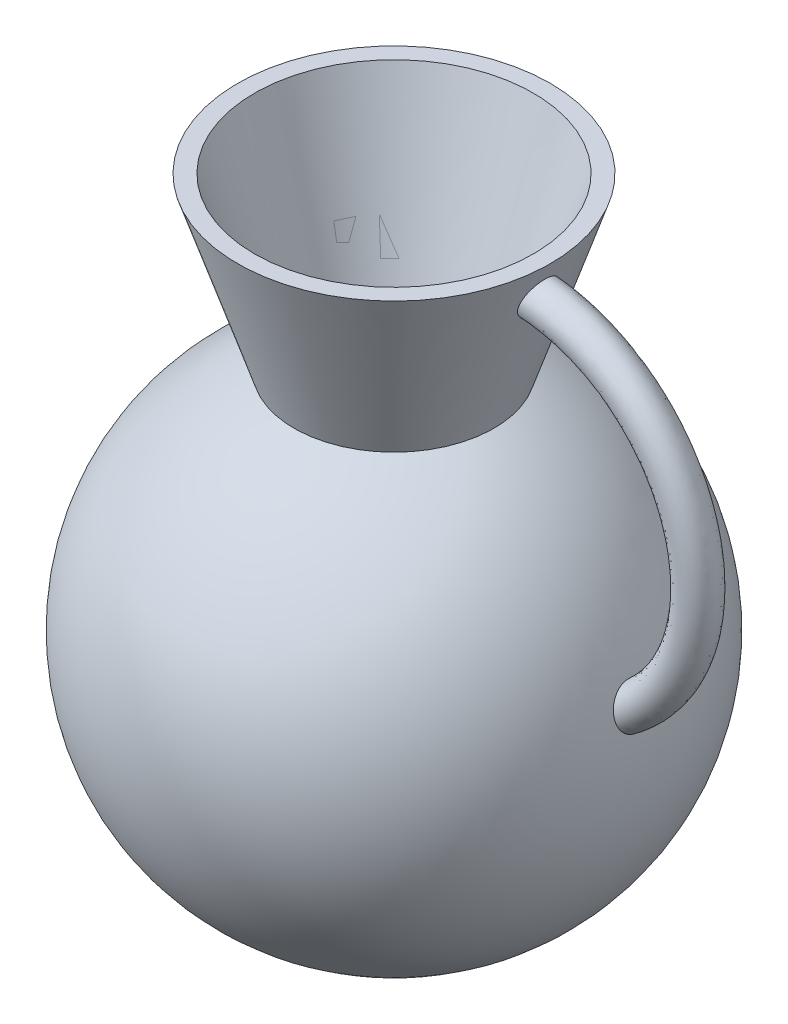
ISO-10303-21;
HEADER;
FILE_DESCRIPTION(('STEP AP214'),'2;1');
FILE_NAME('part.step','',(''),(''),'','','');
FILE_SCHEMA(('AUTOMOTIVE_DESIGN { 1 0 10303 214 1 1 1 1 }'));
ENDSEC;
DATA;
#1=APPLICATION_CONTEXT('core data for automotive mechanical design processes');
#2=APPLICATION_PROTOCOL_DEFINITION('international standard','automotive_design',2000,#1);
#3=PRODUCT_CONTEXT('',#1,'mechanical');
#4=PRODUCT('Part','Part','',(#3));
#5=PRODUCT_RELATED_PRODUCT_CATEGORY('part','',(#4));
#6=PRODUCT_DEFINITION_FORMATION('','',#4);
#7=PRODUCT_DEFINITION_CONTEXT('part definition',#1,'design');
#8=PRODUCT_DEFINITION('design','',#6,#7);
#9=PRODUCT_DEFINITION_SHAPE('','',#8);
#10=(LENGTH_UNIT() NAMED_UNIT(*) SI_UNIT(.MILLI.,.METRE.));
#11=(NAMED_UNIT(*) PLANE_ANGLE_UNIT() SI_UNIT($,.RADIAN.));
#12=(NAMED_UNIT(*) SI_UNIT($,.STERADIAN.) SOLID_ANGLE_UNIT());
#13=UNCERTAINTY_MEASURE_WITH_UNIT(LENGTH_MEASURE(1.E-05),#10,'distance_accuracy_value','');
#14=(GEOMETRIC_REPRESENTATION_CONTEXT(3) GLOBAL_UNCERTAINTY_ASSIGNED_CONTEXT((#13)) GLOBAL_UNIT_ASSIGNED_CONTEXT((#10,
#11,#12)) REPRESENTATION_CONTEXT('',''));
#15=CARTESIAN_POINT('',(0.,0.,0.));
#16=DIRECTION('',(0.,0.,1.));
#17=DIRECTION('',(1.,0.,0.));
#18=AXIS2_PLACEMENT_3D('',#15,#16,#17);
#19=CARTESIAN_POINT('',(0.,74.0588762852864,0.));
#20=DIRECTION('',(0.,1.,0.));
#21=DIRECTION('',(0.,0.,1.));
#22=AXIS2_PLACEMENT_3D('',#19,#20,#21);
#23=CONICAL_SURFACE('',#22,13.1866009471648,0.318744232350078);
#24=CARTESIAN_POINT('',(0.,99.8387449515132,0.));
#25=DIRECTION('',(0.,1.,0.));
#26=DIRECTION('',(0.,0.,1.));
#27=AXIS2_PLACEMENT_3D('',#24,#25,#26);
#28=CIRCLE('',#27,21.6938624665845);
#29=CARTESIAN_POINT('',(0.,99.8387449515132,21.6938624665845));
#30=VERTEX_POINT('',#29);
#31=EDGE_CURVE('E11',#30,#30,#28,.F.);
#32=ORIENTED_EDGE('',*,*,#31,.F.);
#33=EDGE_LOOP('',(#32));
#34=FACE_BOUND('',#33,.T.);
#35=CARTESIAN_POINT('',(0.,71.8426822581929,0.));
#36=DIRECTION('',(0.,-1.,0.));
#37=DIRECTION('',(0.,0.,-1.));
#38=AXIS2_PLACEMENT_3D('',#35,#36,#37);
#39=CIRCLE('',#38,12.4552650970733);
#40=CARTESIAN_POINT('',(0.,71.8426822581929,-12.4552650970733));
#41=VERTEX_POINT('',#40);
#42=EDGE_CURVE('E54',#41,#41,#39,.T.);
#43=ORIENTED_EDGE('',*,*,#42,.T.);
#44=EDGE_LOOP('',(#43));
#45=FACE_BOUND('',#44,.T.);
#46=ADVANCED_FACE('F49',(#34,#45),#23,.F.);
#47=CARTESIAN_POINT('',(0.,38.2899424262077,0.));
#48=DIRECTION('',(0.,-1.,0.));
#49=DIRECTION('',(-1.,0.,0.));
#50=AXIS2_PLACEMENT_3D('',#47,#48,#49);
#51=SPHERICAL_SURFACE('',#50,35.7899424262077);
#52=ORIENTED_EDGE('',*,*,#42,.F.);
#53=EDGE_LOOP('',(#52));
#54=FACE_BOUND('',#53,.T.);
#55=ADVANCED_FACE('F62',(#54),#51,.F.);
#56=OPEN_SHELL('',(#46,#55));
#57=SHELL_BASED_SURFACE_MODEL('B2',(#56));
#58=CARTESIAN_POINT('',(0.,38.2899424262077,0.));
#59=DIRECTION('',(0.,-1.,0.));
#60=DIRECTION('',(-1.,0.,0.));
#61=AXIS2_PLACEMENT_3D('',#58,#59,#60);
#62=SPHERICAL_SURFACE('',#61,38.2899424262077);
#63=CARTESIAN_POINT('',(37.9355283935638,43.4875742430462,0.));
#64=CARTESIAN_POINT('',(37.9355261015643,43.4875858481802,-0.157933360444489));
#65=CARTESIAN_POINT('',(37.9327060160052,43.5009479959671,-0.316014553461099));
#66=CARTESIAN_POINT('',(37.9215204873269,43.5538867387111,-0.627654197078701));
#67=CARTESIAN_POINT('',(37.9131471771171,43.5935005235309,-0.781205908094663));
#68=CARTESIAN_POINT('',(37.8911836287647,43.697209165149,-1.07901627772444));
#69=CARTESIAN_POINT('',(37.8776047349446,43.7612507858194,-1.22329435318908));
#70=CARTESIAN_POINT('',(37.8456959039435,43.9113503306973,-1.49923209160159));
#71=CARTESIAN_POINT('',(37.8273667074557,43.9974048225097,-1.63089371739566));
#72=CARTESIAN_POINT('',(37.7858482482907,44.1917055912168,-1.88285019807154));
#73=CARTESIAN_POINT('',(37.7625194119025,44.3005866477069,-2.00263121662743));
#74=CARTESIAN_POINT('',(37.7120674907361,44.5351398325327,-2.2234593990031));
#75=CARTESIAN_POINT('',(37.6849432268402,44.660817178391,-2.32450071822649));
#76=CARTESIAN_POINT('',(37.6253262593124,44.9358331328088,-2.51347961166638));
#77=CARTESIAN_POINT('',(37.5925789809347,45.0862557507716,-2.5997580445385));
#78=CARTESIAN_POINT('',(37.5243144100588,45.3981889110757,-2.74760652351043));
#79=CARTESIAN_POINT('',(37.4887960662283,45.5597036589213,-2.80916713677716));
#80=CARTESIAN_POINT('',(37.4126382801933,45.9040865634904,-2.91127745900275));
#81=CARTESIAN_POINT('',(37.3718217015611,46.0875927724751,-2.94954659987977));
#82=CARTESIAN_POINT('',(37.2888854229696,46.4580884127531,-2.99611763171413));
#83=CARTESIAN_POINT('',(37.2467652558493,46.645079082977,-3.00440865114434));
#84=CARTESIAN_POINT('',(37.1595026560535,47.0299493905033,-2.99077881112345));
#85=CARTESIAN_POINT('',(37.1143398714071,47.2277569881588,-2.96688321595232));
#86=CARTESIAN_POINT('',(37.0248298465806,47.6170824452631,-2.88578385610287));
#87=CARTESIAN_POINT('',(36.9804844854217,47.8085864563298,-2.82851133449396));
#88=CARTESIAN_POINT('',(36.8935495663234,48.1814941702133,-2.68058690845582));
#89=CARTESIAN_POINT('',(36.8509873472805,48.3627496998056,-2.58954402148319));
#90=CARTESIAN_POINT('',(36.7698574174585,48.7060769416384,-2.37565944867056));
#91=CARTESIAN_POINT('',(36.7312795231774,48.8681977198808,-2.25290178668668));
#92=CARTESIAN_POINT('',(36.6788145257868,49.0874835627675,-2.05104449043293));
#93=CARTESIAN_POINT('',(36.6626712882251,49.1547624535222,-1.9832537826099));
#94=CARTESIAN_POINT('',(36.6318506276583,49.2829014801984,-1.8415749448434));
#95=CARTESIAN_POINT('',(36.6171723393295,49.3437654065491,-1.76769046207868));
#96=CARTESIAN_POINT('',(36.5894908270204,49.4582999253126,-1.6143099508065));
#97=CARTESIAN_POINT('',(36.5764867325065,49.511974256704,-1.53481687217112));
#98=CARTESIAN_POINT('',(36.5523464901676,49.6114282792391,-1.37075122319947));
#99=CARTESIAN_POINT('',(36.5412103321446,49.6572080134834,-1.28617868059801));
#100=CARTESIAN_POINT('',(36.5221605138188,49.7354011136289,-1.12262555560045));
#101=CARTESIAN_POINT('',(36.5140238090945,49.7687450290272,-1.04411482134737));
#102=CARTESIAN_POINT('',(36.4994893687334,49.8282427172622,-0.884260613632248));
#103=CARTESIAN_POINT('',(36.4930914224826,49.8543973609326,-0.802917484603175));
#104=CARTESIAN_POINT('',(36.482139817086,49.8991329269225,-0.638105338003654));
#105=CARTESIAN_POINT('',(36.4775850135365,49.9177185488794,-0.554637673881843));
#106=CARTESIAN_POINT('',(36.4703912121744,49.9470594261377,-0.386255972542294));
#107=CARTESIAN_POINT('',(36.4677520742153,49.9578152542525,-0.301342041596014));
#108=CARTESIAN_POINT('',(36.4646022565865,49.9706508000874,-0.13943627550076));
#109=CARTESIAN_POINT('',(36.4639040024066,49.9734951364768,-0.0625077594182249));
#110=CARTESIAN_POINT('',(36.4641030096527,49.9726843720806,0.0913400874299616));
#111=CARTESIAN_POINT('',(36.4650008096922,49.9690270772174,0.168259406331111));
#112=CARTESIAN_POINT('',(36.4683800629035,49.9552556248877,0.321442076668946));
#113=CARTESIAN_POINT('',(36.4708606214461,49.9451451149973,0.397705774021289));
#114=CARTESIAN_POINT('',(36.4773676018359,49.9186050486236,0.549067309752856));
#115=CARTESIAN_POINT('',(36.4813946075945,49.9021731052731,0.624164696596318));
#116=CARTESIAN_POINT('',(36.4954768801076,49.8446593010842,0.843077809668257));
#117=CARTESIAN_POINT('',(36.5076289293054,49.7949724111284,0.984597630772383));
#118=CARTESIAN_POINT('',(36.5370266401155,49.6744214712045,1.25759619261692));
#119=CARTESIAN_POINT('',(36.554273191114,49.6035537235064,1.3890731750538));
#120=CARTESIAN_POINT('',(36.5942318235826,49.4387601434914,1.64643760586559));
#121=CARTESIAN_POINT('',(36.6171942307241,49.3437723969308,1.77160921394827));
#122=CARTESIAN_POINT('',(36.6545929137729,49.1883720303957,1.94705644189836));
#123=CARTESIAN_POINT('',(36.6675576865972,49.134393536448,2.00350815670589));
#124=CARTESIAN_POINT('',(36.6943752247707,49.0224857653457,2.11217818353919));
#125=CARTESIAN_POINT('',(36.7082284036972,48.9645546473225,2.16439449787494));
#126=CARTESIAN_POINT('',(36.7538487139186,48.773320057282,2.32453267995243));
#127=CARTESIAN_POINT('',(36.787132161966,48.6331228004795,2.42396517581188));
#128=CARTESIAN_POINT('',(36.8564265187655,48.3395230949388,2.60000997074014));
#129=CARTESIAN_POINT('',(36.8924420863432,48.1860980263654,2.67658213908745));
#130=CARTESIAN_POINT('',(36.9700645916392,47.8534144295457,2.81268816717162));
#131=CARTESIAN_POINT('',(37.0118631619376,47.6731297097561,2.86961620574553));
#132=CARTESIAN_POINT('',(37.0964219667721,47.3059341483061,2.95370340743422));
#133=CARTESIAN_POINT('',(37.1391826128527,47.1190204504982,2.98084957390686));
#134=CARTESIAN_POINT('',(37.2273525155134,46.7310468946064,3.00564938190486));
#135=CARTESIAN_POINT('',(37.2727541559797,46.5298541524273,3.00128143474899));
#136=CARTESIAN_POINT('',(37.3621330082567,46.1310955718989,2.9578909153403));
#137=CARTESIAN_POINT('',(37.406112320816,45.9335245906249,2.91892212123363));
#138=CARTESIAN_POINT('',(37.4700315301096,45.6445881145665,2.83481246764317));
#139=CARTESIAN_POINT('',(37.4909878651802,45.549551300188,2.80251893864909));
#140=CARTESIAN_POINT('',(37.5320801853596,45.3626419984517,2.72947518010567));
#141=CARTESIAN_POINT('',(37.5522167137417,45.2707674219813,2.68873066372498));
#142=CARTESIAN_POINT('',(37.5915139456409,45.0909648275053,2.59891426793612));
#143=CARTESIAN_POINT('',(37.6106746389108,45.003036850944,2.5498423011052));
#144=CARTESIAN_POINT('',(37.6478576209123,44.8319561905149,2.44357266320763));
#145=CARTESIAN_POINT('',(37.6658798102242,44.7488039237435,2.38637428391513));
#146=CARTESIAN_POINT('',(37.6994828977141,44.5933877790274,2.26813276310447));
#147=CARTESIAN_POINT('',(37.7151463378252,44.5207674727533,2.20758139661846));
#148=CARTESIAN_POINT('',(37.7451869731879,44.3812020958806,2.07996905204923));
#149=CARTESIAN_POINT('',(37.7595642870891,44.3142565018,2.0129086756374));
#150=CARTESIAN_POINT('',(37.7868931492015,44.1867683294095,1.87269995648037));
#151=CARTESIAN_POINT('',(37.7998449090792,44.1262248005722,1.79955252038312));
#152=CARTESIAN_POINT('',(37.8241896009954,44.0122400480373,1.64767780295122));
#153=CARTESIAN_POINT('',(37.8355827068691,43.958798032334,1.56895114535083));
#154=CARTESIAN_POINT('',(37.8557084361854,43.8642637940732,1.41404373586874));
#155=CARTESIAN_POINT('',(37.8645895997951,43.8224868006365,1.33829952847417));
#156=CARTESIAN_POINT('',(37.8808765543648,43.7457929654615,1.18326711213178));
#157=CARTESIAN_POINT('',(37.8882825273557,43.7108752773273,1.10397934192161));
#158=CARTESIAN_POINT('',(37.9015314466285,43.648357871123,0.942606140417039));
#159=CARTESIAN_POINT('',(37.9073771994442,43.6207450138781,0.860526036093724));
#160=CARTESIAN_POINT('',(37.9174584691716,43.5730970561849,0.69413534879281));
#161=CARTESIAN_POINT('',(37.9216946646048,43.553058762639,0.609825721755727));
#162=CARTESIAN_POINT('',(37.9285648311529,43.5205494772271,0.438348655312332));
#163=CARTESIAN_POINT('',(37.9311733299132,43.5081987984121,0.351157232797603));
#164=CARTESIAN_POINT('',(37.9346557301054,43.4917080406926,0.17599250078528));
#165=CARTESIAN_POINT('',(37.9355296709379,43.4875677752884,0.088019209093465));
#166=CARTESIAN_POINT('',(37.9355283935638,43.4875742430462,0.));
#167=B_SPLINE_CURVE_WITH_KNOTS('',3,(#63,#64,#65,#66,#67,#68,#69,#70,#71,#72,#73,#74,#75,#76,
#77,#78,#79,#80,#81,#82,#83,#84,#85,#86,#87,#88,#89,#90,#91,#92,#93,#94,#95,#96,#97,#98,#99,
#100,#101,#102,#103,#104,#105,#106,#107,#108,#109,#110,#111,#112,#113,#114,#115,#116,#117,#118,
#119,#120,#121,#122,#123,#124,#125,#126,#127,#128,#129,#130,#131,#132,#133,#134,#135,#136,#137,
#138,#139,#140,#141,#142,#143,#144,#145,#146,#147,#148,#149,#150,#151,#152,#153,#154,#155,#156,
#157,#158,#159,#160,#161,#162,#163,#164,#165,#166),.UNSPECIFIED.,.T.,.F.,(4,2,2,2,2,2,2,2,2,2,2,
2,2,2,2,2,2,2,2,2,2,2,2,2,2,2,2,2,2,2,2,2,2,2,2,2,2,2,2,2,2,2,2,2,2,2,2,2,2,2,2,4),(0.,
0.473476622589933,0.947625442548178,1.42074678926413,1.89379440863449,2.38234283778606,
2.87104338166737,3.39823932159573,3.92563625965607,4.49869488649049,5.07196131146559,
5.68204904577176,6.29339803420117,6.91205794440499,7.52909531629285,7.81935240890508,
8.10943702345101,8.39937018767534,8.68930176895459,8.94600756838211,9.2026822594151,
9.45919733617704,9.71569364487989,9.94636062872394,10.17710546954,10.407720000906,
10.6384216940487,11.0876736823058,11.5370041463194,12.0112866776871,12.2486262834131,
12.4860771907245,13.0089614563421,13.5327583063045,14.1111194897389,14.689732966482,
15.305778983896,15.9208691884816,16.228154138686,16.5352320264698,16.8423131382003,
17.149421028825,17.4365613985819,17.7236752512625,18.0107464155409,18.297785536906,
18.5583109292752,18.8188041542043,19.0788255950736,19.3387372999559,19.6026206518289,
19.8664980095152),.UNSPECIFIED.);
#168=CARTESIAN_POINT('',(37.9355283935638,43.4875742430462,0.));
#169=VERTEX_POINT('',#168);
#170=EDGE_CURVE('E48',#169,#169,#167,.T.);
#171=ORIENTED_EDGE('',*,*,#170,.F.);
#172=EDGE_LOOP('',(#171));
#173=FACE_BOUND('',#172,.T.);
#174=CARTESIAN_POINT('',(0.,73.2754405508589,0.));
#175=DIRECTION('',(0.,-1.,0.));
#176=DIRECTION('',(0.,0.,-1.));
#177=AXIS2_PLACEMENT_3D('',#174,#175,#176);
#178=CIRCLE('',#177,15.5606751772642);
#179=CARTESIAN_POINT('',(0.,73.2754405508589,-15.5606751772642));
#180=VERTEX_POINT('',#179);
#181=EDGE_CURVE('E146',#180,#180,#178,.T.);
#182=ORIENTED_EDGE('',*,*,#181,.T.);
#183=EDGE_LOOP('',(#182));
#184=FACE_BOUND('',#183,.T.);
#185=ADVANCED_FACE('F81',(#173,#184),#62,.T.);
#186=CARTESIAN_POINT('',(0.,99.8387449515132,0.));
#187=DIRECTION('',(0.,1.,0.));
#188=DIRECTION('',(0.,0.,1.));
#189=AXIS2_PLACEMENT_3D('',#186,#187,#188);
#190=PLANE('',#189);
#191=CARTESIAN_POINT('',(0.,99.8387449515132,0.));
#192=DIRECTION('',(0.,1.,0.));
#193=DIRECTION('',(0.,0.,1.));
#194=AXIS2_PLACEMENT_3D('',#191,#192,#193);
#195=CIRCLE('',#194,21.6938624665845);
#196=CARTESIAN_POINT('',(0.,99.8387449515132,21.6938624665845));
#197=VERTEX_POINT('',#196);
#198=EDGE_CURVE('E141',#197,#197,#195,.F.);
#199=ORIENTED_EDGE('',*,*,#198,.T.);
#200=EDGE_LOOP('',(#199));
#201=FACE_BOUND('',#200,.T.);
#202=CARTESIAN_POINT('',(0.,99.8387449515132,0.));
#203=DIRECTION('',(0.,-1.,0.));
#204=DIRECTION('',(0.,0.,-1.));
#205=AXIS2_PLACEMENT_3D('',#202,#203,#204);
#206=CIRCLE('',#205,24.3264675977806);
#207=CARTESIAN_POINT('',(0.,99.8387449515132,-24.3264675977806));
#208=VERTEX_POINT('',#207);
#209=EDGE_CURVE('E85',#208,#208,#206,.T.);
#210=ORIENTED_EDGE('',*,*,#209,.F.);
#211=EDGE_LOOP('',(#210));
#212=FACE_BOUND('',#211,.T.);
#213=ADVANCED_FACE('F130',(#201,#212),#190,.T.);
#214=CARTESIAN_POINT('',(0.,73.2754405508589,0.));
#215=DIRECTION('',(0.,1.,0.));
#216=DIRECTION('',(0.,0.,1.));
#217=AXIS2_PLACEMENT_3D('',#214,#215,#216);
#218=CONICAL_SURFACE('',#217,15.5606751772642,0.318744232350078);
#219=CARTESIAN_POINT('',(23.5085881268252,97.3602945949677,0.));
#220=CARTESIAN_POINT('',(23.5085824551509,97.3602852802534,0.162650323265428));
#221=CARTESIAN_POINT('',(23.5026965782478,97.3476099112552,0.325415565230302));
#222=CARTESIAN_POINT('',(23.4794632949356,97.2973164092361,0.646307866500626));
#223=CARTESIAN_POINT('',(23.4621035567716,97.2596714394983,0.804429744077382));
#224=CARTESIAN_POINT('',(23.4169138326947,97.1608110085687,1.11123989616741));
#225=CARTESIAN_POINT('',(23.3891009725873,97.0996340969586,1.25994313850405));
#226=CARTESIAN_POINT('',(23.3244431228525,96.955681707039,1.54429765309924));
#227=CARTESIAN_POINT('',(23.2875989454208,96.8729081708935,1.67995009750301));
#228=CARTESIAN_POINT('',(23.2056254815509,96.6858983802673,1.93815371185203));
#229=CARTESIAN_POINT('',(23.1603148323284,96.5811846486523,2.06030097023538));
#230=CARTESIAN_POINT('',(23.0640837690265,96.3545069873628,2.28476891020845));
#231=CARTESIAN_POINT('',(23.0131620372675,96.232539003866,2.38708491909233));
#232=CARTESIAN_POINT('',(22.9054150413952,95.9686259442003,2.57377825559258));
#233=CARTESIAN_POINT('',(22.8484272214366,95.8260287927068,2.65714087712932));
#234=CARTESIAN_POINT('',(22.7329023064897,95.5290800908951,2.79781115272075));
#235=CARTESIAN_POINT('',(22.6743649303581,95.374726397862,2.85511404387034));
#236=CARTESIAN_POINT('',(22.5563750634322,95.0540522895789,2.94331276992341));
#237=CARTESIAN_POINT('',(22.4969386571096,94.8875245213072,2.97347907335281));
#238=CARTESIAN_POINT('',(22.3808123774316,94.5508053436232,3.00373440395071));
#239=CARTESIAN_POINT('',(22.3241224503346,94.3806140059917,3.00382401988036));
#240=CARTESIAN_POINT('',(22.215640882219,94.0426258826643,2.97362312806095));
#241=CARTESIAN_POINT('',(22.1638186888951,93.8748206864519,2.94353821001387));
#242=CARTESIAN_POINT('',(22.0660127434979,93.545568113561,2.85369423873144));
#243=CARTESIAN_POINT('',(22.0200280427172,93.384119706729,2.79394001511464));
#244=CARTESIAN_POINT('',(21.9359512144007,93.0769975013242,2.64812196233215));
#245=CARTESIAN_POINT('',(21.8976801197307,92.9310162805723,2.56280872931801));
#246=CARTESIAN_POINT('',(21.8279327821002,92.654711176576,2.36759450194919));
#247=CARTESIAN_POINT('',(21.7964556510096,92.5243852478077,2.25769672519887));
#248=CARTESIAN_POINT('',(21.7409492886416,92.2863635734507,2.01914448229274));
#249=CARTESIAN_POINT('',(21.7167690510723,92.1782263950368,1.89096518004984));
#250=CARTESIAN_POINT('',(21.674687499823,91.9843893574613,1.61772396602846));
#251=CARTESIAN_POINT('',(21.6567859361228,91.8986886049034,1.47266272680438));
#252=CARTESIAN_POINT('',(21.6270097957047,91.7529085783211,1.17092006656861));
#253=CARTESIAN_POINT('',(21.6150931088118,91.69265077777,1.0143289853393));
#254=CARTESIAN_POINT('',(21.5967527859306,91.5986833500251,0.693067504616956));
#255=CARTESIAN_POINT('',(21.5903292068789,91.5649739980083,0.528397021399028));
#256=CARTESIAN_POINT('',(21.582744014228,91.5250699028181,0.195352518050924));
#257=CARTESIAN_POINT('',(21.5815913759255,91.5189220914653,0.026972671029098));
#258=CARTESIAN_POINT('',(21.5845285960998,91.5344501553796,-0.308454641260664));
#259=CARTESIAN_POINT('',(21.5886185014189,91.5561262792547,-0.475502094610185));
#260=CARTESIAN_POINT('',(21.6022011280368,91.6267103383462,-0.80375588536174));
#261=CARTESIAN_POINT('',(21.6117012288998,91.6756554667927,-0.964953923979137));
#262=CARTESIAN_POINT('',(21.6364139573082,91.7993329968313,-1.27666401293774));
#263=CARTESIAN_POINT('',(21.651626446982,91.8740647760455,-1.42717632108043));
#264=CARTESIAN_POINT('',(21.6880940522234,92.0468618000877,-1.71293406186256));
#265=CARTESIAN_POINT('',(21.7093373054406,92.1448811776962,-1.8482087440297));
#266=CARTESIAN_POINT('',(21.7581783508073,92.3612959150351,-2.10000287166037));
#267=CARTESIAN_POINT('',(21.7857759412319,92.4796906278997,-2.2165229123096));
#268=CARTESIAN_POINT('',(21.8474071708183,92.7330758778324,-2.42753219019853));
#269=CARTESIAN_POINT('',(21.8814357442116,92.8680533233788,-2.52203863789338));
#270=CARTESIAN_POINT('',(21.955744452138,93.1505377981187,-2.68671644399158));
#271=CARTESIAN_POINT('',(21.9960247886522,93.2980452320594,-2.75688701591822));
#272=CARTESIAN_POINT('',(22.0826952586513,93.60269762053,-2.87186241879566));
#273=CARTESIAN_POINT('',(22.129141415596,93.7599228764014,-2.9164118460168));
#274=CARTESIAN_POINT('',(22.2268674264531,94.0781816585868,-2.9782772455778));
#275=CARTESIAN_POINT('',(22.2781479005466,94.2392156715252,-2.99558971871145));
#276=CARTESIAN_POINT('',(22.3854883817943,94.5645950952762,-3.00301711257143));
#277=CARTESIAN_POINT('',(22.4416337490892,94.7289268622783,-2.99246703175218));
#278=CARTESIAN_POINT('',(22.5558996552616,95.052734764117,-2.94330426898657));
#279=CARTESIAN_POINT('',(22.6140205209486,95.2122100871901,-2.90468692208058));
#280=CARTESIAN_POINT('',(22.7018502057668,95.4465146815846,-2.82598549379568));
#281=CARTESIAN_POINT('',(22.7316205694282,95.5247674018712,-2.79576159289114));
#282=CARTESIAN_POINT('',(22.7908538712161,95.6783844957828,-2.72845284251927));
#283=CARTESIAN_POINT('',(22.8203168837392,95.7537495807703,-2.69136969610093));
#284=CARTESIAN_POINT('',(22.8786260934815,95.9010566734131,-2.61058533267247));
#285=CARTESIAN_POINT('',(22.9074725107011,95.9729999135947,-2.56688652267168));
#286=CARTESIAN_POINT('',(22.9642767799486,96.1130658331841,-2.4730974011167));
#287=CARTESIAN_POINT('',(22.9922336135383,96.1811841973799,-2.42300007137713));
#288=CARTESIAN_POINT('',(23.0744211012814,96.3793646425625,-2.26327954513921));
#289=CARTESIAN_POINT('',(23.1268340884229,96.5029146026155,-2.14441281037114));
#290=CARTESIAN_POINT('',(23.22412160951,96.7286038823779,-1.88521418528559));
#291=CARTESIAN_POINT('',(23.2689988710162,96.8307509522089,-1.74489009676044));
#292=CARTESIAN_POINT('',(23.3282374012418,96.964025387073,-1.52357541462588));
#293=CARTESIAN_POINT('',(23.3464248121069,97.0046641895282,-1.44917506465484));
#294=CARTESIAN_POINT('',(23.380200664545,97.079754641949,-1.29680583558861));
#295=CARTESIAN_POINT('',(23.3957913329496,97.1142115951249,-1.21884008789738));
#296=CARTESIAN_POINT('',(23.424144821609,97.1766232949721,-1.05994303160015));
#297=CARTESIAN_POINT('',(23.436910371989,97.204584320462,-0.979014674931403));
#298=CARTESIAN_POINT('',(23.4594424576879,97.2537877067213,-0.814747776388891));
#299=CARTESIAN_POINT('',(23.469209282958,97.2750307170716,-0.731409468390067));
#300=CARTESIAN_POINT('',(23.4877071318482,97.3151838585512,-0.541196563922332));
#301=CARTESIAN_POINT('',(23.4955206734585,97.3320778108932,-0.433797340623718));
#302=CARTESIAN_POINT('',(23.5059629703368,97.354636082894,-0.217615860737318));
#303=CARTESIAN_POINT('',(23.5085919218933,97.3603008276907,-0.108833656666153));
#304=CARTESIAN_POINT('',(23.5085881268252,97.3602945949677,0.));
#305=B_SPLINE_CURVE_WITH_KNOTS('',3,(#219,#220,#221,#222,#223,#224,#225,#226,#227,#228,#229,
#230,#231,#232,#233,#234,#235,#236,#237,#238,#239,#240,#241,#242,#243,#244,#245,#246,#247,#248,
#249,#250,#251,#252,#253,#254,#255,#256,#257,#258,#259,#260,#261,#262,#263,#264,#265,#266,#267,
#268,#269,#270,#271,#272,#273,#274,#275,#276,#277,#278,#279,#280,#281,#282,#283,#284,#285,#286,
#287,#288,#289,#290,#291,#292,#293,#294,#295,#296,#297,#298,#299,#300,#301,#302,#303,#304),
.UNSPECIFIED.,.T.,.F.,(4,2,2,2,2,2,2,2,2,2,2,2,2,2,2,2,2,2,2,2,2,2,2,2,2,2,2,2,2,2,2,2,2,2,2,2,
2,2,2,2,2,2,4),(0.,0.487559485319246,0.975643838607785,1.46293200336529,1.95017636185471,
2.44939531922667,2.94873176163645,3.47054341131389,3.9924503935781,4.52800172803506,
5.06354257889623,5.5954592219352,6.12728930707762,6.64481984586176,7.16228269027231,
7.66815716932803,8.17401150189744,8.67625490202684,9.1785035078835,9.68160701916005,
10.1847150257198,10.6885109262679,11.192294668218,11.69509426637,12.1978779048379,
12.7002671325313,13.202672594718,13.7100031388245,14.2173988557568,14.7370134925407,
15.256714512365,15.5234934959459,15.7902063309545,16.0568223587051,16.3237333755412,
16.8587628355346,17.3935982218886,17.6534363110658,17.9130504163578,18.1724125306141,
18.4317495588576,18.7580009283017,19.0842399456258),.UNSPECIFIED.);
#306=CARTESIAN_POINT('',(23.5085881268252,97.3602945949677,0.));
#307=VERTEX_POINT('',#306);
#308=EDGE_CURVE('E90',#307,#307,#305,.T.);
#309=ORIENTED_EDGE('',*,*,#308,.F.);
#310=EDGE_LOOP('',(#309));
#311=FACE_BOUND('',#310,.T.);
#312=ORIENTED_EDGE('',*,*,#209,.T.);
#313=EDGE_LOOP('',(#312));
#314=FACE_BOUND('',#313,.T.);
#315=ORIENTED_EDGE('',*,*,#181,.F.);
#316=EDGE_LOOP('',(#315));
#317=FACE_BOUND('',#316,.T.);
#318=ADVANCED_FACE('F124',(#311,#314,#317),#218,.T.);
#319=CARTESIAN_POINT('',(0.,38.2899424262077,0.));
#320=DIRECTION('',(0.,-1.,0.));
#321=DIRECTION('',(-1.,0.,0.));
#322=AXIS2_PLACEMENT_3D('',#319,#320,#321);
#323=SPHERICAL_SURFACE('',#322,35.7899424262077);
#324=CARTESIAN_POINT('',(0.,71.8426822581929,0.));
#325=DIRECTION('',(0.,-1.,0.));
#326=DIRECTION('',(0.,0.,-1.));
#327=AXIS2_PLACEMENT_3D('',#324,#325,#326);
#328=CIRCLE('',#327,12.4552650970733);
#329=CARTESIAN_POINT('',(0.,71.8426822581929,-12.4552650970733));
#330=VERTEX_POINT('',#329);
#331=EDGE_CURVE('E106',#330,#330,#328,.T.);
#332=ORIENTED_EDGE('',*,*,#331,.F.);
#333=EDGE_LOOP('',(#332));
#334=FACE_BOUND('',#333,.T.);
#335=ADVANCED_FACE('F115',(#334),#323,.F.);
#336=CARTESIAN_POINT('',(0.,74.0588762852864,0.));
#337=DIRECTION('',(0.,1.,0.));
#338=DIRECTION('',(0.,0.,1.));
#339=AXIS2_PLACEMENT_3D('',#336,#337,#338);
#340=CONICAL_SURFACE('',#339,13.1866009471648,0.318744232350078);
#341=ORIENTED_EDGE('',*,*,#198,.F.);
#342=EDGE_LOOP('',(#341));
#343=FACE_BOUND('',#342,.T.);
#344=ORIENTED_EDGE('',*,*,#331,.T.);
#345=EDGE_LOOP('',(#344));
#346=FACE_BOUND('',#345,.T.);
#347=ADVANCED_FACE('F114',(#343,#346),#340,.F.);
#348=CARTESIAN_POINT('',(11.8796675045573,96.2816463966833,0.));
#349=CARTESIAN_POINT('',(59.3893463538421,110.422838317447,0.));
#350=CARTESIAN_POINT('',(78.1858369975598,64.5552589962892,0.));
#351=CARTESIAN_POINT('',(34.4152411273888,41.2898806311687,0.));
#352=CARTESIAN_POINT('',(11.8796675045573,96.2816463966833,6.));
#353=CARTESIAN_POINT('',(59.3893463538421,110.422838317447,6.));
#354=CARTESIAN_POINT('',(78.1858369975598,64.5552589962892,6.));
#355=CARTESIAN_POINT('',(34.4152411273888,41.2898806311687,6.));
#356=CARTESIAN_POINT('',(14.0992450089166,90.707287626193,6.));
#357=CARTESIAN_POINT('',(52.356102224417,101.164225340191,6.));
#358=CARTESIAN_POINT('',(66.5663010681355,64.137141750154,6.));
#359=CARTESIAN_POINT('',(31.1362009124233,46.3146090087667,6.));
#360=CARTESIAN_POINT('',(14.0992450089166,90.707287626193,0.));
#361=CARTESIAN_POINT('',(52.356102224417,101.164225340191,0.));
#362=CARTESIAN_POINT('',(66.5663010681355,64.137141750154,0.));
#363=CARTESIAN_POINT('',(31.1362009124233,46.3146090087667,0.));
#364=CARTESIAN_POINT('',(14.0992450089166,90.707287626193,-6.));
#365=CARTESIAN_POINT('',(52.356102224417,101.164225340191,-6.));
#366=CARTESIAN_POINT('',(66.5663010681355,64.137141750154,-6.));
#367=CARTESIAN_POINT('',(31.1362009124233,46.3146090087667,-6.));
#368=CARTESIAN_POINT('',(11.8796675045573,96.2816463966833,-6.));
#369=CARTESIAN_POINT('',(59.3893463538421,110.422838317447,-6.));
#370=CARTESIAN_POINT('',(78.1858369975598,64.5552589962892,-6.));
#371=CARTESIAN_POINT('',(34.4152411273888,41.2898806311687,-6.));
#372=CARTESIAN_POINT('',(11.8796675045573,96.2816463966833,0.));
#373=CARTESIAN_POINT('',(59.3893463538421,110.422838317447,0.));
#374=CARTESIAN_POINT('',(78.1858369975598,64.5552589962892,0.));
#375=CARTESIAN_POINT('',(34.4152411273888,41.2898806311687,0.));
#376=(BOUNDED_SURFACE() B_SPLINE_SURFACE(3,3,((#348,#349,#350,#351),(#352,#353,#354,#355),(#356,
#357,#358,#359),(#360,#361,#362,#363),(#364,#365,#366,#367),(#368,#369,#370,#371),(#372,#373,
#374,#375)),.UNSPECIFIED.,.T.,.F.,.F.) B_SPLINE_SURFACE_WITH_KNOTS((4,3,4),(4,4),(0.,0.5,1.),
(0.,1.),.UNSPECIFIED.) GEOMETRIC_REPRESENTATION_ITEM() RATIONAL_B_SPLINE_SURFACE(((1.,
0.399641508442314,0.399641508442314,1.),(0.333333333333333,0.133213836147438,0.133213836147438,
0.333333333333333),(0.333333333333333,0.133213836147438,0.133213836147438,0.333333333333333),
(1.,0.399641508442314,0.399641508442314,1.),(0.333333333333333,0.133213836147438,
0.133213836147438,0.333333333333333),(0.333333333333333,0.133213836147438,0.133213836147438,
0.333333333333333),(1.,0.399641508442314,0.399641508442314,1.))) REPRESENTATION_ITEM('') SURFACE());
#377=ORIENTED_EDGE('',*,*,#170,.T.);
#378=EDGE_LOOP('',(#377));
#379=FACE_BOUND('',#378,.T.);
#380=ORIENTED_EDGE('',*,*,#308,.T.);
#381=EDGE_LOOP('',(#380));
#382=FACE_BOUND('',#381,.T.);
#383=ADVANCED_FACE('F108',(#379,#382),#376,.T.);
#384=CLOSED_SHELL('',(#185,#213,#318,#335,#347,#383));
#385=MANIFOLD_SOLID_BREP('B6',#384);
#386=ADVANCED_BREP_SHAPE_REPRESENTATION('',(#18,#385),#14);
#387=MANIFOLD_SURFACE_SHAPE_REPRESENTATION('',(#18,#57),#14);
#388=SHAPE_REPRESENTATION('',(#18),#14);
#389=SHAPE_DEFINITION_REPRESENTATION(#9,#388);
#390=SHAPE_REPRESENTATION_RELATIONSHIP('','',#388,#386);
#391=SHAPE_REPRESENTATION_RELATIONSHIP('','',#388,#387);
ENDSEC;
END-ISO-10303-21;
